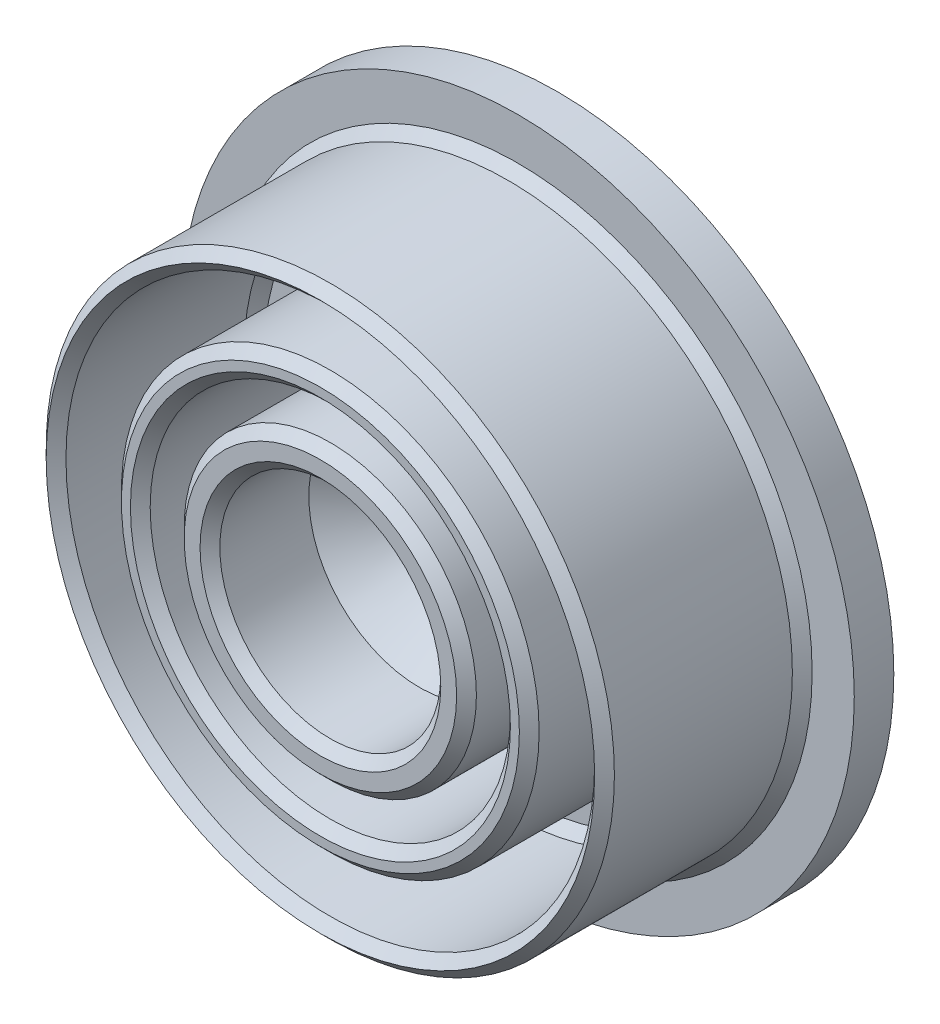
ISO-10303-21;
HEADER;
FILE_DESCRIPTION(('STEP AP214'),'2;1');
FILE_NAME('part.step','',(''),(''),'','','');
FILE_SCHEMA(('AUTOMOTIVE_DESIGN { 1 0 10303 214 1 1 1 1 }'));
ENDSEC;
DATA;
#1=APPLICATION_CONTEXT('core data for automotive mechanical design processes');
#2=APPLICATION_PROTOCOL_DEFINITION('international standard','automotive_design',2000,#1);
#3=PRODUCT_CONTEXT('',#1,'mechanical');
#4=PRODUCT('Part','Part','',(#3));
#5=PRODUCT_RELATED_PRODUCT_CATEGORY('part','',(#4));
#6=PRODUCT_DEFINITION_FORMATION('','',#4);
#7=PRODUCT_DEFINITION_CONTEXT('part definition',#1,'design');
#8=PRODUCT_DEFINITION('design','',#6,#7);
#9=PRODUCT_DEFINITION_SHAPE('','',#8);
#10=(LENGTH_UNIT() NAMED_UNIT(*) SI_UNIT(.MILLI.,.METRE.));
#11=(NAMED_UNIT(*) PLANE_ANGLE_UNIT() SI_UNIT($,.RADIAN.));
#12=(NAMED_UNIT(*) SI_UNIT($,.STERADIAN.) SOLID_ANGLE_UNIT());
#13=UNCERTAINTY_MEASURE_WITH_UNIT(LENGTH_MEASURE(1.E-05),#10,'distance_accuracy_value','');
#14=(GEOMETRIC_REPRESENTATION_CONTEXT(3) GLOBAL_UNCERTAINTY_ASSIGNED_CONTEXT((#13)) GLOBAL_UNIT_ASSIGNED_CONTEXT((#10,
#11,#12)) REPRESENTATION_CONTEXT('',''));
#15=CARTESIAN_POINT('',(0.,0.,0.));
#16=DIRECTION('',(0.,0.,1.));
#17=DIRECTION('',(1.,0.,0.));
#18=AXIS2_PLACEMENT_3D('',#15,#16,#17);
#19=CARTESIAN_POINT('',(0.,0.,-2.));
#20=DIRECTION('',(0.,0.,1.));
#21=DIRECTION('',(1.,0.,0.));
#22=AXIS2_PLACEMENT_3D('',#19,#20,#21);
#23=CYLINDRICAL_SURFACE('',#22,17.);
#24=CARTESIAN_POINT('',(0.,0.,-2.));
#25=DIRECTION('',(0.,0.,1.));
#26=DIRECTION('',(1.,0.,0.));
#27=AXIS2_PLACEMENT_3D('',#24,#25,#26);
#28=CIRCLE('',#27,17.);
#29=CARTESIAN_POINT('',(17.,0.,-2.));
#30=VERTEX_POINT('',#29);
#31=EDGE_CURVE('E133',#30,#30,#28,.T.);
#32=ORIENTED_EDGE('',*,*,#31,.T.);
#33=EDGE_LOOP('',(#32));
#34=FACE_BOUND('',#33,.T.);
#35=CARTESIAN_POINT('',(0.,0.,0.));
#36=DIRECTION('',(0.,0.,1.));
#37=DIRECTION('',(1.,0.,0.));
#38=AXIS2_PLACEMENT_3D('',#35,#36,#37);
#39=CIRCLE('',#38,17.);
#40=CARTESIAN_POINT('',(17.,0.,0.));
#41=VERTEX_POINT('',#40);
#42=EDGE_CURVE('E132',#41,#41,#39,.T.);
#43=ORIENTED_EDGE('',*,*,#42,.F.);
#44=EDGE_LOOP('',(#43));
#45=FACE_BOUND('',#44,.T.);
#46=ADVANCED_FACE('F56',(#34,#45),#23,.T.);
#47=CARTESIAN_POINT('',(0.,0.,-2.));
#48=DIRECTION('',(0.,0.,1.));
#49=DIRECTION('',(1.,0.,0.));
#50=AXIS2_PLACEMENT_3D('',#47,#48,#49);
#51=PLANE('',#50);
#52=ORIENTED_EDGE('',*,*,#31,.F.);
#53=EDGE_LOOP('',(#52));
#54=FACE_BOUND('',#53,.T.);
#55=ADVANCED_FACE('F141',(#54),#51,.F.);
#56=CARTESIAN_POINT('',(0.,0.,0.));
#57=DIRECTION('',(0.,0.,1.));
#58=DIRECTION('',(1.,0.,0.));
#59=AXIS2_PLACEMENT_3D('',#56,#57,#58);
#60=PLANE('',#59);
#61=CARTESIAN_POINT('',(0.,0.,0.));
#62=DIRECTION('',(0.,0.,1.));
#63=DIRECTION('',(1.,0.,0.));
#64=AXIS2_PLACEMENT_3D('',#61,#62,#63);
#65=CIRCLE('',#64,14.8690884139183);
#66=CARTESIAN_POINT('',(14.8690884139183,0.,0.));
#67=VERTEX_POINT('',#66);
#68=EDGE_CURVE('E96',#67,#67,#65,.F.);
#69=ORIENTED_EDGE('',*,*,#68,.T.);
#70=EDGE_LOOP('',(#69));
#71=FACE_BOUND('',#70,.T.);
#72=ORIENTED_EDGE('',*,*,#42,.T.);
#73=EDGE_LOOP('',(#72));
#74=FACE_BOUND('',#73,.T.);
#75=ADVANCED_FACE('F143',(#71,#74),#60,.T.);
#76=CARTESIAN_POINT('',(0.,0.,10.));
#77=DIRECTION('',(0.,0.,-1.));
#78=DIRECTION('',(-1.,0.,0.));
#79=AXIS2_PLACEMENT_3D('',#76,#77,#78);
#80=CYLINDRICAL_SURFACE('',#79,13.3690884139183);
#81=CARTESIAN_POINT('',(0.,0.,9.5));
#82=DIRECTION('',(0.,0.,1.));
#83=DIRECTION('',(1.,0.,0.));
#84=AXIS2_PLACEMENT_3D('',#81,#82,#83);
#85=CIRCLE('',#84,13.3690884139183);
#86=CARTESIAN_POINT('',(13.3690884139183,0.,9.5));
#87=VERTEX_POINT('',#86);
#88=EDGE_CURVE('E70',#87,#87,#85,.T.);
#89=ORIENTED_EDGE('',*,*,#88,.T.);
#90=EDGE_LOOP('',(#89));
#91=FACE_BOUND('',#90,.T.);
#92=CARTESIAN_POINT('',(0.,0.,0.499999999999992));
#93=DIRECTION('',(0.,0.,1.));
#94=DIRECTION('',(1.,0.,0.));
#95=AXIS2_PLACEMENT_3D('',#92,#93,#94);
#96=CIRCLE('',#95,13.3690884139183);
#97=CARTESIAN_POINT('',(13.3690884139183,0.,0.499999999999992));
#98=VERTEX_POINT('',#97);
#99=EDGE_CURVE('E104',#98,#98,#96,.F.);
#100=ORIENTED_EDGE('',*,*,#99,.T.);
#101=EDGE_LOOP('',(#100));
#102=FACE_BOUND('',#101,.T.);
#103=ADVANCED_FACE('F151',(#91,#102),#80,.F.);
#104=CARTESIAN_POINT('',(0.,0.,10.));
#105=DIRECTION('',(0.,0.,-1.));
#106=DIRECTION('',(-1.,0.,0.));
#107=AXIS2_PLACEMENT_3D('',#104,#105,#106);
#108=CYLINDRICAL_SURFACE('',#107,14.3690884139183);
#109=CARTESIAN_POINT('',(0.,0.,9.5));
#110=DIRECTION('',(0.,0.,1.));
#111=DIRECTION('',(1.,0.,0.));
#112=AXIS2_PLACEMENT_3D('',#109,#110,#111);
#113=CIRCLE('',#112,14.3690884139183);
#114=CARTESIAN_POINT('',(14.3690884139183,0.,9.5));
#115=VERTEX_POINT('',#114);
#116=EDGE_CURVE('E11',#115,#115,#113,.F.);
#117=ORIENTED_EDGE('',*,*,#116,.T.);
#118=EDGE_LOOP('',(#117));
#119=FACE_BOUND('',#118,.T.);
#120=CARTESIAN_POINT('',(0.,0.,0.500000000000004));
#121=DIRECTION('',(0.,0.,1.));
#122=DIRECTION('',(1.,0.,0.));
#123=AXIS2_PLACEMENT_3D('',#120,#121,#122);
#124=CIRCLE('',#123,14.3690884139183);
#125=CARTESIAN_POINT('',(14.3690884139183,0.,0.500000000000004));
#126=VERTEX_POINT('',#125);
#127=EDGE_CURVE('E103',#126,#126,#124,.T.);
#128=ORIENTED_EDGE('',*,*,#127,.T.);
#129=EDGE_LOOP('',(#128));
#130=FACE_BOUND('',#129,.T.);
#131=ADVANCED_FACE('F250',(#119,#130),#108,.T.);
#132=CARTESIAN_POINT('',(0.,0.,0.));
#133=DIRECTION('',(0.,0.,1.));
#134=DIRECTION('',(1.,0.,0.));
#135=AXIS2_PLACEMENT_3D('',#132,#133,#134);
#136=CIRCLE('',#135,11.0623381007429);
#137=CARTESIAN_POINT('',(11.0623381007429,0.,0.));
#138=VERTEX_POINT('',#137);
#139=EDGE_CURVE('E110',#138,#138,#136,.F.);
#140=ORIENTED_EDGE('',*,*,#139,.T.);
#141=EDGE_LOOP('',(#140));
#142=FACE_BOUND('',#141,.T.);
#143=CARTESIAN_POINT('',(0.,0.,0.));
#144=DIRECTION('',(0.,0.,1.));
#145=DIRECTION('',(1.,0.,0.));
#146=AXIS2_PLACEMENT_3D('',#143,#144,#145);
#147=CIRCLE('',#146,12.8690884139183);
#148=CARTESIAN_POINT('',(12.8690884139183,0.,0.));
#149=VERTEX_POINT('',#148);
#150=EDGE_CURVE('E109',#149,#149,#147,.T.);
#151=ORIENTED_EDGE('',*,*,#150,.T.);
#152=EDGE_LOOP('',(#151));
#153=FACE_BOUND('',#152,.T.);
#154=ADVANCED_FACE('F156',(#142,#153),#60,.T.);
#155=CARTESIAN_POINT('',(0.,0.,10.));
#156=DIRECTION('',(0.,0.,-1.));
#157=DIRECTION('',(-1.,0.,0.));
#158=AXIS2_PLACEMENT_3D('',#155,#156,#157);
#159=CYLINDRICAL_SURFACE('',#158,9.108597541474);
#160=CARTESIAN_POINT('',(0.,0.,9.5));
#161=DIRECTION('',(0.,0.,1.));
#162=DIRECTION('',(1.,0.,0.));
#163=AXIS2_PLACEMENT_3D('',#160,#161,#162);
#164=CIRCLE('',#163,9.108597541474);
#165=CARTESIAN_POINT('',(9.108597541474,0.,9.5));
#166=VERTEX_POINT('',#165);
#167=EDGE_CURVE('E84',#166,#166,#164,.T.);
#168=ORIENTED_EDGE('',*,*,#167,.T.);
#169=EDGE_LOOP('',(#168));
#170=FACE_BOUND('',#169,.T.);
#171=CARTESIAN_POINT('',(0.,0.,0.500000000000006));
#172=DIRECTION('',(0.,0.,1.));
#173=DIRECTION('',(1.,0.,0.));
#174=AXIS2_PLACEMENT_3D('',#171,#172,#173);
#175=CIRCLE('',#174,9.108597541474);
#176=CARTESIAN_POINT('',(9.108597541474,0.,0.500000000000006));
#177=VERTEX_POINT('',#176);
#178=EDGE_CURVE('E123',#177,#177,#175,.F.);
#179=ORIENTED_EDGE('',*,*,#178,.T.);
#180=EDGE_LOOP('',(#179));
#181=FACE_BOUND('',#180,.T.);
#182=ADVANCED_FACE('F254',(#170,#181),#159,.F.);
#183=CARTESIAN_POINT('',(0.,0.,10.));
#184=DIRECTION('',(0.,0.,-1.));
#185=DIRECTION('',(-1.,0.,0.));
#186=AXIS2_PLACEMENT_3D('',#183,#184,#185);
#187=CYLINDRICAL_SURFACE('',#186,10.5623381007429);
#188=CARTESIAN_POINT('',(0.,0.,9.5));
#189=DIRECTION('',(0.,0.,1.));
#190=DIRECTION('',(1.,0.,0.));
#191=AXIS2_PLACEMENT_3D('',#188,#189,#190);
#192=CIRCLE('',#191,10.5623381007429);
#193=CARTESIAN_POINT('',(10.5623381007429,0.,9.5));
#194=VERTEX_POINT('',#193);
#195=EDGE_CURVE('E75',#194,#194,#192,.F.);
#196=ORIENTED_EDGE('',*,*,#195,.T.);
#197=EDGE_LOOP('',(#196));
#198=FACE_BOUND('',#197,.T.);
#199=CARTESIAN_POINT('',(0.,0.,0.500000000000016));
#200=DIRECTION('',(0.,0.,1.));
#201=DIRECTION('',(1.,0.,0.));
#202=AXIS2_PLACEMENT_3D('',#199,#200,#201);
#203=CIRCLE('',#202,10.5623381007429);
#204=CARTESIAN_POINT('',(10.5623381007429,0.,0.500000000000016));
#205=VERTEX_POINT('',#204);
#206=EDGE_CURVE('E113',#205,#205,#203,.T.);
#207=ORIENTED_EDGE('',*,*,#206,.T.);
#208=EDGE_LOOP('',(#207));
#209=FACE_BOUND('',#208,.T.);
#210=ADVANCED_FACE('F258',(#198,#209),#187,.T.);
#211=CARTESIAN_POINT('',(0.,0.,10.));
#212=DIRECTION('',(0.,0.,1.));
#213=DIRECTION('',(1.,0.,0.));
#214=AXIS2_PLACEMENT_3D('',#211,#212,#213);
#215=PLANE('',#214);
#216=CARTESIAN_POINT('',(0.,0.,10.));
#217=DIRECTION('',(0.,0.,1.));
#218=DIRECTION('',(1.,0.,0.));
#219=AXIS2_PLACEMENT_3D('',#216,#217,#218);
#220=CIRCLE('',#219,9.608597541474);
#221=CARTESIAN_POINT('',(9.608597541474,0.,10.));
#222=VERTEX_POINT('',#221);
#223=EDGE_CURVE('E80',#222,#222,#220,.F.);
#224=ORIENTED_EDGE('',*,*,#223,.T.);
#225=EDGE_LOOP('',(#224));
#226=FACE_BOUND('',#225,.T.);
#227=CARTESIAN_POINT('',(0.,0.,10.));
#228=DIRECTION('',(0.,0.,1.));
#229=DIRECTION('',(1.,0.,0.));
#230=AXIS2_PLACEMENT_3D('',#227,#228,#229);
#231=CIRCLE('',#230,10.0623381007429);
#232=CARTESIAN_POINT('',(10.0623381007429,0.,10.));
#233=VERTEX_POINT('',#232);
#234=EDGE_CURVE('E78',#233,#233,#231,.T.);
#235=ORIENTED_EDGE('',*,*,#234,.T.);
#236=EDGE_LOOP('',(#235));
#237=FACE_BOUND('',#236,.T.);
#238=ADVANCED_FACE('F262',(#226,#237),#215,.T.);
#239=CARTESIAN_POINT('',(0.,0.,0.));
#240=DIRECTION('',(0.,0.,1.));
#241=DIRECTION('',(1.,0.,0.));
#242=AXIS2_PLACEMENT_3D('',#239,#240,#241);
#243=CIRCLE('',#242,8.608597541474);
#244=CARTESIAN_POINT('',(8.608597541474,0.,0.));
#245=VERTEX_POINT('',#244);
#246=EDGE_CURVE('E118',#245,#245,#243,.T.);
#247=ORIENTED_EDGE('',*,*,#246,.T.);
#248=EDGE_LOOP('',(#247));
#249=FACE_BOUND('',#248,.T.);
#250=CARTESIAN_POINT('',(0.,0.,0.));
#251=DIRECTION('',(0.,0.,1.));
#252=DIRECTION('',(1.,0.,0.));
#253=AXIS2_PLACEMENT_3D('',#250,#251,#252);
#254=CIRCLE('',#253,7.89001933485133);
#255=CARTESIAN_POINT('',(7.89001933485133,0.,0.));
#256=VERTEX_POINT('',#255);
#257=EDGE_CURVE('E125',#256,#256,#254,.F.);
#258=ORIENTED_EDGE('',*,*,#257,.T.);
#259=EDGE_LOOP('',(#258));
#260=FACE_BOUND('',#259,.T.);
#261=ADVANCED_FACE('F253',(#249,#260),#60,.T.);
#262=CARTESIAN_POINT('',(0.,0.,10.));
#263=DIRECTION('',(0.,0.,-1.));
#264=DIRECTION('',(-1.,0.,0.));
#265=AXIS2_PLACEMENT_3D('',#262,#263,#264);
#266=CYLINDRICAL_SURFACE('',#265,5.5871576915469);
#267=CARTESIAN_POINT('',(0.,0.,9.5));
#268=DIRECTION('',(0.,0.,1.));
#269=DIRECTION('',(1.,0.,0.));
#270=AXIS2_PLACEMENT_3D('',#267,#268,#269);
#271=CIRCLE('',#270,5.5871576915469);
#272=CARTESIAN_POINT('',(5.5871576915469,0.,9.5));
#273=VERTEX_POINT('',#272);
#274=EDGE_CURVE('E94',#273,#273,#271,.T.);
#275=ORIENTED_EDGE('',*,*,#274,.T.);
#276=EDGE_LOOP('',(#275));
#277=FACE_BOUND('',#276,.T.);
#278=CARTESIAN_POINT('',(0.,0.,5.00000000000003));
#279=DIRECTION('',(0.,0.,1.));
#280=DIRECTION('',(1.,0.,0.));
#281=AXIS2_PLACEMENT_3D('',#278,#279,#280);
#282=CIRCLE('',#281,5.5871576915469);
#283=CARTESIAN_POINT('',(5.5871576915469,0.,5.00000000000003));
#284=VERTEX_POINT('',#283);
#285=EDGE_CURVE('E134',#284,#284,#282,.F.);
#286=ORIENTED_EDGE('',*,*,#285,.T.);
#287=EDGE_LOOP('',(#286));
#288=FACE_BOUND('',#287,.T.);
#289=ADVANCED_FACE('F263',(#277,#288),#266,.F.);
#290=CARTESIAN_POINT('',(0.,0.,10.));
#291=DIRECTION('',(0.,0.,-1.));
#292=DIRECTION('',(-1.,0.,0.));
#293=AXIS2_PLACEMENT_3D('',#290,#291,#292);
#294=CYLINDRICAL_SURFACE('',#293,7.39001933485133);
#295=CARTESIAN_POINT('',(0.,0.,9.5));
#296=DIRECTION('',(0.,0.,1.));
#297=DIRECTION('',(1.,0.,0.));
#298=AXIS2_PLACEMENT_3D('',#295,#296,#297);
#299=CIRCLE('',#298,7.39001933485133);
#300=CARTESIAN_POINT('',(7.39001933485133,0.,9.5));
#301=VERTEX_POINT('',#300);
#302=EDGE_CURVE('E89',#301,#301,#299,.F.);
#303=ORIENTED_EDGE('',*,*,#302,.T.);
#304=EDGE_LOOP('',(#303));
#305=FACE_BOUND('',#304,.T.);
#306=CARTESIAN_POINT('',(0.,0.,0.500000000000006));
#307=DIRECTION('',(0.,0.,1.));
#308=DIRECTION('',(1.,0.,0.));
#309=AXIS2_PLACEMENT_3D('',#306,#307,#308);
#310=CIRCLE('',#309,7.39001933485133);
#311=CARTESIAN_POINT('',(7.39001933485133,0.,0.500000000000006));
#312=VERTEX_POINT('',#311);
#313=EDGE_CURVE('E116',#312,#312,#310,.T.);
#314=ORIENTED_EDGE('',*,*,#313,.T.);
#315=EDGE_LOOP('',(#314));
#316=FACE_BOUND('',#315,.T.);
#317=ADVANCED_FACE('F269',(#305,#316),#294,.T.);
#318=CARTESIAN_POINT('',(0.,0.,10.));
#319=DIRECTION('',(0.,0.,1.));
#320=DIRECTION('',(1.,0.,0.));
#321=AXIS2_PLACEMENT_3D('',#318,#319,#320);
#322=PLANE('',#321);
#323=CARTESIAN_POINT('',(0.,0.,10.));
#324=DIRECTION('',(0.,0.,1.));
#325=DIRECTION('',(1.,0.,0.));
#326=AXIS2_PLACEMENT_3D('',#323,#324,#325);
#327=CIRCLE('',#326,6.08715769154691);
#328=CARTESIAN_POINT('',(6.08715769154691,0.,10.));
#329=VERTEX_POINT('',#328);
#330=EDGE_CURVE('E88',#329,#329,#327,.F.);
#331=ORIENTED_EDGE('',*,*,#330,.T.);
#332=EDGE_LOOP('',(#331));
#333=FACE_BOUND('',#332,.T.);
#334=CARTESIAN_POINT('',(0.,0.,10.));
#335=DIRECTION('',(0.,0.,1.));
#336=DIRECTION('',(1.,0.,0.));
#337=AXIS2_PLACEMENT_3D('',#334,#335,#336);
#338=CIRCLE('',#337,6.89001933485133);
#339=CARTESIAN_POINT('',(6.89001933485133,0.,10.));
#340=VERTEX_POINT('',#339);
#341=EDGE_CURVE('E95',#340,#340,#338,.T.);
#342=ORIENTED_EDGE('',*,*,#341,.T.);
#343=EDGE_LOOP('',(#342));
#344=FACE_BOUND('',#343,.T.);
#345=ADVANCED_FACE('F280',(#333,#344),#322,.T.);
#346=CARTESIAN_POINT('',(0.,0.,0.));
#347=DIRECTION('',(0.,0.,1.));
#348=DIRECTION('',(1.,0.,0.));
#349=AXIS2_PLACEMENT_3D('',#346,#347,#348);
#350=CIRCLE('',#349,0.587157691546922);
#351=CARTESIAN_POINT('',(0.58715769154692,0.,0.));
#352=VERTEX_POINT('',#351);
#353=EDGE_CURVE('E129',#352,#352,#350,.T.);
#354=ORIENTED_EDGE('',*,*,#353,.T.);
#355=EDGE_LOOP('',(#354));
#356=FACE_BOUND('',#355,.T.);
#357=ADVANCED_FACE('F152',(#356),#60,.T.);
#358=CARTESIAN_POINT('',(0.,0.,5.00000000000003));
#359=DIRECTION('',(0.,0.,1.));
#360=DIRECTION('',(1.,0.,0.));
#361=AXIS2_PLACEMENT_3D('',#358,#359,#360);
#362=CONICAL_SURFACE('',#361,5.5871576915469,0.785398163397443);
#363=CARTESIAN_POINT('',(0.58715769154692,0.,0.));
#364=CARTESIAN_POINT('',(0.639241024880253,0.,0.0520833333333339));
#365=CARTESIAN_POINT('',(0.691324358213586,0.,0.104166666666668));
#366=CARTESIAN_POINT('',(0.795491024880253,0.,0.208333333333335));
#367=CARTESIAN_POINT('',(0.847574358213586,0.,0.260416666666668));
#368=CARTESIAN_POINT('',(0.951741024880253,0.,0.364583333333336));
#369=CARTESIAN_POINT('',(1.00382435821359,0.,0.416666666666669));
#370=CARTESIAN_POINT('',(1.10799102488025,0.,0.520833333333337));
#371=CARTESIAN_POINT('',(1.16007435821359,0.,0.57291666666667));
#372=CARTESIAN_POINT('',(1.26424102488025,0.,0.677083333333338));
#373=CARTESIAN_POINT('',(1.31632435821358,0.,0.729166666666671));
#374=CARTESIAN_POINT('',(1.42049102488025,0.,0.833333333333339));
#375=CARTESIAN_POINT('',(1.47257435821358,0.,0.885416666666672));
#376=CARTESIAN_POINT('',(1.57674102488025,0.,0.98958333333334));
#377=CARTESIAN_POINT('',(1.62882435821358,0.,1.04166666666667));
#378=CARTESIAN_POINT('',(1.73299102488025,0.,1.14583333333334));
#379=CARTESIAN_POINT('',(1.78507435821358,0.,1.19791666666667));
#380=CARTESIAN_POINT('',(1.88924102488025,0.,1.30208333333334));
#381=CARTESIAN_POINT('',(1.94132435821358,0.,1.35416666666667));
#382=CARTESIAN_POINT('',(2.04549102488025,0.,1.45833333333334));
#383=CARTESIAN_POINT('',(2.09757435821358,0.,1.51041666666668));
#384=CARTESIAN_POINT('',(2.20174102488025,0.,1.61458333333334));
#385=CARTESIAN_POINT('',(2.25382435821358,0.,1.66666666666668));
#386=CARTESIAN_POINT('',(2.35799102488025,0.,1.77083333333334));
#387=CARTESIAN_POINT('',(2.41007435821358,0.,1.82291666666668));
#388=CARTESIAN_POINT('',(2.51424102488025,0.,1.92708333333335));
#389=CARTESIAN_POINT('',(2.56632435821358,0.,1.97916666666668));
#390=CARTESIAN_POINT('',(2.67049102488025,0.,2.08333333333335));
#391=CARTESIAN_POINT('',(2.72257435821358,0.,2.13541666666668));
#392=CARTESIAN_POINT('',(2.82674102488025,0.,2.23958333333335));
#393=CARTESIAN_POINT('',(2.87882435821358,0.,2.29166666666668));
#394=CARTESIAN_POINT('',(2.98299102488025,0.,2.39583333333335));
#395=CARTESIAN_POINT('',(3.03507435821358,0.,2.44791666666668));
#396=CARTESIAN_POINT('',(3.13924102488024,0.,2.55208333333335));
#397=CARTESIAN_POINT('',(3.19132435821358,0.,2.60416666666668));
#398=CARTESIAN_POINT('',(3.29549102488024,0.,2.70833333333335));
#399=CARTESIAN_POINT('',(3.34757435821358,0.,2.76041666666668));
#400=CARTESIAN_POINT('',(3.45174102488024,0.,2.86458333333335));
#401=CARTESIAN_POINT('',(3.50382435821358,0.,2.91666666666669));
#402=CARTESIAN_POINT('',(3.60799102488024,0.,3.02083333333335));
#403=CARTESIAN_POINT('',(3.66007435821358,0.,3.07291666666669));
#404=CARTESIAN_POINT('',(3.76424102488024,0.,3.17708333333335));
#405=CARTESIAN_POINT('',(3.81632435821358,0.,3.22916666666669));
#406=CARTESIAN_POINT('',(3.92049102488024,0.,3.33333333333335));
#407=CARTESIAN_POINT('',(3.97257435821358,0.,3.38541666666669));
#408=CARTESIAN_POINT('',(4.07674102488024,0.,3.48958333333336));
#409=CARTESIAN_POINT('',(4.12882435821358,0.,3.54166666666669));
#410=CARTESIAN_POINT('',(4.23299102488024,0.,3.64583333333336));
#411=CARTESIAN_POINT('',(4.28507435821357,0.,3.69791666666669));
#412=CARTESIAN_POINT('',(4.38924102488024,0.,3.80208333333336));
#413=CARTESIAN_POINT('',(4.44132435821357,0.,3.85416666666669));
#414=CARTESIAN_POINT('',(4.54549102488024,0.,3.95833333333336));
#415=CARTESIAN_POINT('',(4.59757435821357,0.,4.01041666666669));
#416=CARTESIAN_POINT('',(4.70174102488024,0.,4.11458333333336));
#417=CARTESIAN_POINT('',(4.75382435821357,0.,4.16666666666669));
#418=CARTESIAN_POINT('',(4.85799102488024,0.,4.27083333333336));
#419=CARTESIAN_POINT('',(4.91007435821357,0.,4.32291666666669));
#420=CARTESIAN_POINT('',(5.01424102488024,0.,4.42708333333336));
#421=CARTESIAN_POINT('',(5.06632435821357,0.,4.4791666666667));
#422=CARTESIAN_POINT('',(5.17049102488024,0.,4.58333333333336));
#423=CARTESIAN_POINT('',(5.22257435821357,0.,4.6354166666667));
#424=CARTESIAN_POINT('',(5.32674102488024,0.,4.73958333333336));
#425=CARTESIAN_POINT('',(5.37882435821357,0.,4.7916666666667));
#426=CARTESIAN_POINT('',(5.48299102488024,0.,4.89583333333337));
#427=CARTESIAN_POINT('',(5.53507435821357,0.,4.9479166666667));
#428=CARTESIAN_POINT('',(5.5871576915469,0.,5.00000000000003));
#429=B_SPLINE_CURVE_WITH_KNOTS('',3,(#363,#364,#365,#366,#367,#368,#369,#370,#371,#372,#373,
#374,#375,#376,#377,#378,#379,#380,#381,#382,#383,#384,#385,#386,#387,#388,#389,#390,#391,#392,
#393,#394,#395,#396,#397,#398,#399,#400,#401,#402,#403,#404,#405,#406,#407,#408,#409,#410,#411,
#412,#413,#414,#415,#416,#417,#418,#419,#420,#421,#422,#423,#424,#425,#426,#427,#428),
.UNSPECIFIED.,.F.,.F.,(4,2,2,2,2,2,2,2,2,2,2,2,2,2,2,2,2,2,2,2,2,2,2,2,2,2,2,2,2,2,2,2,4),(0.,
0.220970869120796,0.441941738241593,0.66291260736239,0.883883476483186,1.10485434560398,
1.32582521472478,1.54679608384557,1.76776695296637,1.98873782208717,2.20970869120796,
2.43067956032876,2.65165042944956,2.87262129857035,3.09359216769115,3.31456303681195,
3.53553390593274,3.75650477505354,3.97747564417433,4.19844651329513,4.41941738241593,
4.64038825153672,4.86135912065752,5.08232998977832,5.30330085889911,5.52427172801991,
5.74524259714071,5.9662134662615,6.1871843353823,6.40815520450309,6.62912607362389,
6.85009694274469,7.07106781186548),.UNSPECIFIED.);
#430=EDGE_CURVE('BSEAM162',#352,#284,#429,.T.);
#431=ORIENTED_EDGE('',*,*,#353,.F.);
#432=ORIENTED_EDGE('',*,*,#285,.F.);
#433=ORIENTED_EDGE('',*,*,#430,.T.);
#434=ORIENTED_EDGE('',*,*,#430,.F.);
#435=EDGE_LOOP('',(#431,#433,#432,#434));
#436=FACE_BOUND('',#435,.T.);
#437=ADVANCED_FACE('F162',(#436),#362,.F.);
#438=CARTESIAN_POINT('',(0.,0.,0.500000000000006));
#439=DIRECTION('',(0.,0.,1.));
#440=DIRECTION('',(1.,0.,0.));
#441=AXIS2_PLACEMENT_3D('',#438,#439,#440);
#442=CONICAL_SURFACE('',#441,9.108597541474,0.785398163397448);
#443=ORIENTED_EDGE('',*,*,#246,.F.);
#444=EDGE_LOOP('',(#443));
#445=FACE_BOUND('',#444,.T.);
#446=ORIENTED_EDGE('',*,*,#178,.F.);
#447=EDGE_LOOP('',(#446));
#448=FACE_BOUND('',#447,.T.);
#449=ADVANCED_FACE('F166',(#445,#448),#442,.F.);
#450=CARTESIAN_POINT('',(0.,0.,0.500000000000006));
#451=DIRECTION('',(0.,0.,-1.));
#452=DIRECTION('',(-1.,0.,0.));
#453=AXIS2_PLACEMENT_3D('',#450,#451,#452);
#454=CONICAL_SURFACE('',#453,7.39001933485133,0.785398163397448);
#455=ORIENTED_EDGE('',*,*,#257,.F.);
#456=EDGE_LOOP('',(#455));
#457=FACE_BOUND('',#456,.T.);
#458=ORIENTED_EDGE('',*,*,#313,.F.);
#459=EDGE_LOOP('',(#458));
#460=FACE_BOUND('',#459,.T.);
#461=ADVANCED_FACE('F174',(#457,#460),#454,.T.);
#462=CARTESIAN_POINT('',(0.,0.,0.500000000000016));
#463=DIRECTION('',(0.,0.,-1.));
#464=DIRECTION('',(-1.,0.,0.));
#465=AXIS2_PLACEMENT_3D('',#462,#463,#464);
#466=CONICAL_SURFACE('',#465,10.5623381007429,0.785398163397447);
#467=ORIENTED_EDGE('',*,*,#139,.F.);
#468=EDGE_LOOP('',(#467));
#469=FACE_BOUND('',#468,.T.);
#470=ORIENTED_EDGE('',*,*,#206,.F.);
#471=EDGE_LOOP('',(#470));
#472=FACE_BOUND('',#471,.T.);
#473=ADVANCED_FACE('F185',(#469,#472),#466,.T.);
#474=CARTESIAN_POINT('',(0.,0.,0.));
#475=DIRECTION('',(0.,0.,1.));
#476=DIRECTION('',(1.,0.,0.));
#477=AXIS2_PLACEMENT_3D('',#474,#475,#476);
#478=CONICAL_SURFACE('',#477,12.8690884139183,0.785398163397452);
#479=ORIENTED_EDGE('',*,*,#99,.F.);
#480=EDGE_LOOP('',(#479));
#481=FACE_BOUND('',#480,.T.);
#482=ORIENTED_EDGE('',*,*,#150,.F.);
#483=EDGE_LOOP('',(#482));
#484=FACE_BOUND('',#483,.T.);
#485=ADVANCED_FACE('F186',(#481,#484),#478,.F.);
#486=CARTESIAN_POINT('',(0.,0.,0.500000000000004));
#487=DIRECTION('',(0.,0.,-1.));
#488=DIRECTION('',(-1.,0.,0.));
#489=AXIS2_PLACEMENT_3D('',#486,#487,#488);
#490=CONICAL_SURFACE('',#489,14.3690884139183,0.78539816339745);
#491=ORIENTED_EDGE('',*,*,#68,.F.);
#492=EDGE_LOOP('',(#491));
#493=FACE_BOUND('',#492,.T.);
#494=ORIENTED_EDGE('',*,*,#127,.F.);
#495=EDGE_LOOP('',(#494));
#496=FACE_BOUND('',#495,.T.);
#497=ADVANCED_FACE('F199',(#493,#496),#490,.T.);
#498=CARTESIAN_POINT('',(0.,0.,9.5));
#499=DIRECTION('',(0.,0.,1.));
#500=DIRECTION('',(1.,0.,0.));
#501=AXIS2_PLACEMENT_3D('',#498,#499,#500);
#502=CONICAL_SURFACE('',#501,5.5871576915469,0.78539816339745);
#503=ORIENTED_EDGE('',*,*,#330,.F.);
#504=EDGE_LOOP('',(#503));
#505=FACE_BOUND('',#504,.T.);
#506=ORIENTED_EDGE('',*,*,#274,.F.);
#507=EDGE_LOOP('',(#506));
#508=FACE_BOUND('',#507,.T.);
#509=ADVANCED_FACE('F202',(#505,#508),#502,.F.);
#510=CARTESIAN_POINT('',(0.,0.,10.));
#511=DIRECTION('',(0.,0.,-1.));
#512=DIRECTION('',(-1.,0.,0.));
#513=AXIS2_PLACEMENT_3D('',#510,#511,#512);
#514=CONICAL_SURFACE('',#513,6.89001933485133,0.785398163397443);
#515=ORIENTED_EDGE('',*,*,#302,.F.);
#516=EDGE_LOOP('',(#515));
#517=FACE_BOUND('',#516,.T.);
#518=ORIENTED_EDGE('',*,*,#341,.F.);
#519=EDGE_LOOP('',(#518));
#520=FACE_BOUND('',#519,.T.);
#521=ADVANCED_FACE('F208',(#517,#520),#514,.T.);
#522=CARTESIAN_POINT('',(0.,0.,9.5));
#523=DIRECTION('',(0.,0.,1.));
#524=DIRECTION('',(1.,0.,0.));
#525=AXIS2_PLACEMENT_3D('',#522,#523,#524);
#526=CONICAL_SURFACE('',#525,9.108597541474,0.785398163397445);
#527=ORIENTED_EDGE('',*,*,#223,.F.);
#528=EDGE_LOOP('',(#527));
#529=FACE_BOUND('',#528,.T.);
#530=ORIENTED_EDGE('',*,*,#167,.F.);
#531=EDGE_LOOP('',(#530));
#532=FACE_BOUND('',#531,.T.);
#533=ADVANCED_FACE('F216',(#529,#532),#526,.F.);
#534=CARTESIAN_POINT('',(0.,0.,10.));
#535=DIRECTION('',(0.,0.,-1.));
#536=DIRECTION('',(-1.,0.,0.));
#537=AXIS2_PLACEMENT_3D('',#534,#535,#536);
#538=CONICAL_SURFACE('',#537,10.0623381007429,0.785398163397447);
#539=ORIENTED_EDGE('',*,*,#195,.F.);
#540=EDGE_LOOP('',(#539));
#541=FACE_BOUND('',#540,.T.);
#542=ORIENTED_EDGE('',*,*,#234,.F.);
#543=EDGE_LOOP('',(#542));
#544=FACE_BOUND('',#543,.T.);
#545=ADVANCED_FACE('F222',(#541,#544),#538,.T.);
#546=CARTESIAN_POINT('',(0.,0.,10.));
#547=DIRECTION('',(0.,0.,-1.));
#548=DIRECTION('',(-1.,0.,0.));
#549=AXIS2_PLACEMENT_3D('',#546,#547,#548);
#550=CONICAL_SURFACE('',#549,13.8690884139183,0.78539816339744);
#551=ORIENTED_EDGE('',*,*,#116,.F.);
#552=EDGE_LOOP('',(#551));
#553=FACE_BOUND('',#552,.T.);
#554=CARTESIAN_POINT('',(0.,0.,10.));
#555=DIRECTION('',(0.,0.,1.));
#556=DIRECTION('',(1.,0.,0.));
#557=AXIS2_PLACEMENT_3D('',#554,#555,#556);
#558=CIRCLE('',#557,13.8690884139183);
#559=CARTESIAN_POINT('',(13.8690884139183,0.,10.));
#560=VERTEX_POINT('',#559);
#561=EDGE_CURVE('E61',#560,#560,#558,.T.);
#562=ORIENTED_EDGE('',*,*,#561,.F.);
#563=EDGE_LOOP('',(#562));
#564=FACE_BOUND('',#563,.T.);
#565=ADVANCED_FACE('F65',(#553,#564),#550,.T.);
#566=CARTESIAN_POINT('',(0.,0.,9.5));
#567=DIRECTION('',(0.,0.,1.));
#568=DIRECTION('',(1.,0.,0.));
#569=AXIS2_PLACEMENT_3D('',#566,#567,#568);
#570=CONICAL_SURFACE('',#569,13.3690884139183,0.785398163397448);
#571=ORIENTED_EDGE('',*,*,#561,.T.);
#572=EDGE_LOOP('',(#571));
#573=FACE_BOUND('',#572,.T.);
#574=ORIENTED_EDGE('',*,*,#88,.F.);
#575=EDGE_LOOP('',(#574));
#576=FACE_BOUND('',#575,.T.);
#577=ADVANCED_FACE('F233',(#573,#576),#570,.F.);
#578=CLOSED_SHELL('',(#46,#55,#75,#103,#131,#154,#182,#210,#238,#261,#289,#317,#345,#357,#437,
#449,#461,#473,#485,#497,#509,#521,#533,#545,#565,#577));
#579=MANIFOLD_SOLID_BREP('B2',#578);
#580=ADVANCED_BREP_SHAPE_REPRESENTATION('',(#18,#579),#14);
#581=SHAPE_DEFINITION_REPRESENTATION(#9,#580);
ENDSEC;
END-ISO-10303-21;
